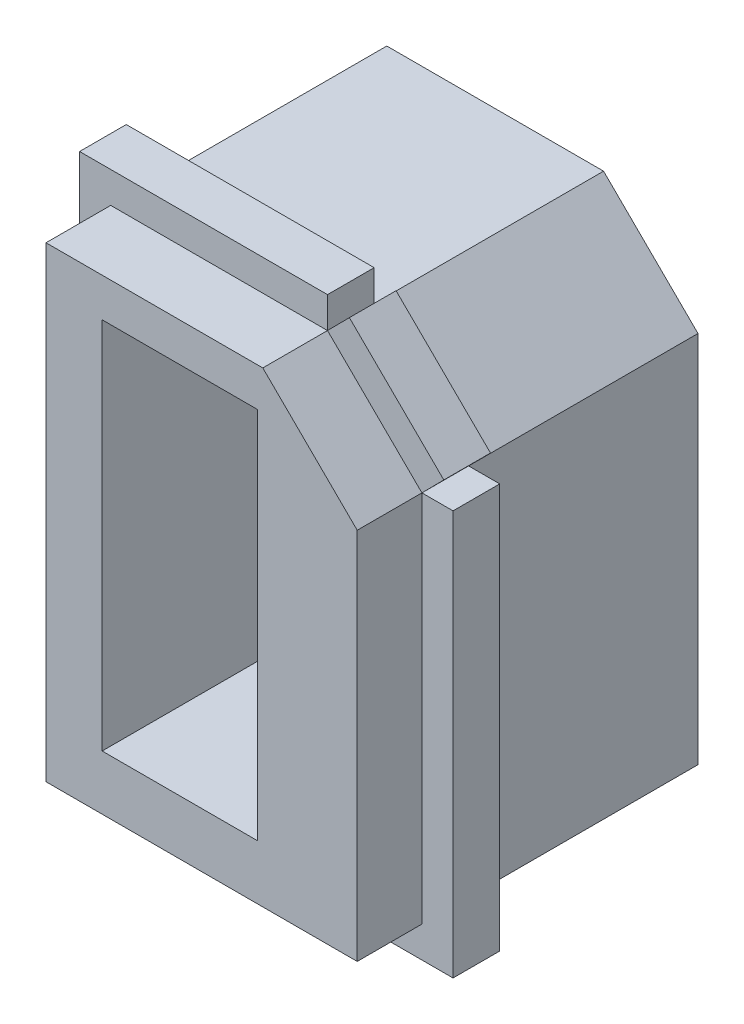
ISO-10303-21;
HEADER;
FILE_DESCRIPTION(('STEP AP214'),'2;1');
FILE_NAME('part.step','',(''),(''),'','','');
FILE_SCHEMA(('AUTOMOTIVE_DESIGN { 1 0 10303 214 1 1 1 1 }'));
ENDSEC;
DATA;
#1=APPLICATION_CONTEXT('core data for automotive mechanical design processes');
#2=APPLICATION_PROTOCOL_DEFINITION('international standard','automotive_design',2000,#1);
#3=PRODUCT_CONTEXT('',#1,'mechanical');
#4=PRODUCT('Part','Part','',(#3));
#5=PRODUCT_RELATED_PRODUCT_CATEGORY('part','',(#4));
#6=PRODUCT_DEFINITION_FORMATION('','',#4);
#7=PRODUCT_DEFINITION_CONTEXT('part definition',#1,'design');
#8=PRODUCT_DEFINITION('design','',#6,#7);
#9=PRODUCT_DEFINITION_SHAPE('','',#8);
#10=(LENGTH_UNIT() NAMED_UNIT(*) SI_UNIT(.MILLI.,.METRE.));
#11=(NAMED_UNIT(*) PLANE_ANGLE_UNIT() SI_UNIT($,.RADIAN.));
#12=(NAMED_UNIT(*) SI_UNIT($,.STERADIAN.) SOLID_ANGLE_UNIT());
#13=UNCERTAINTY_MEASURE_WITH_UNIT(LENGTH_MEASURE(1.E-05),#10,'distance_accuracy_value','');
#14=(GEOMETRIC_REPRESENTATION_CONTEXT(3) GLOBAL_UNCERTAINTY_ASSIGNED_CONTEXT((#13)) GLOBAL_UNIT_ASSIGNED_CONTEXT((#10,
#11,#12)) REPRESENTATION_CONTEXT('',''));
#15=CARTESIAN_POINT('',(0.,0.,0.));
#16=DIRECTION('',(0.,0.,1.));
#17=DIRECTION('',(1.,0.,0.));
#18=AXIS2_PLACEMENT_3D('',#15,#16,#17);
#19=CARTESIAN_POINT('',(-3.03397212543554,15.,10.95));
#20=DIRECTION('',(-0.70311452519662,-0.711076623478463,0.));
#21=DIRECTION('',(0.711076623478463,-0.70311452519662,0.));
#22=AXIS2_PLACEMENT_3D('',#19,#20,#21);
#23=PLANE('',#22);
#24=DIRECTION('',(0.711076623478463,-0.703114525196619,0.));
#25=VECTOR('',#24,1.);
#26=CARTESIAN_POINT('',(-3.03397212543554,15.,8.87087376670331));
#27=LINE('',#26,#25);
#28=CARTESIAN_POINT('',(-3.03397212543554,15.,8.87087376670331));
#29=VERTEX_POINT('',#28);
#30=CARTESIAN_POINT('',(0.,12.,8.87087376670331));
#31=VERTEX_POINT('',#30);
#32=EDGE_CURVE('E392',#29,#31,#27,.T.);
#33=ORIENTED_EDGE('',*,*,#32,.F.);
#34=DIRECTION('',(0.,0.,-1.));
#35=VECTOR('',#34,1.);
#36=CARTESIAN_POINT('',(-3.03397212543554,15.,10.95));
#37=LINE('',#36,#35);
#38=CARTESIAN_POINT('',(-3.03397212543554,15.,10.95));
#39=VERTEX_POINT('',#38);
#40=EDGE_CURVE('E339',#39,#29,#37,.T.);
#41=ORIENTED_EDGE('',*,*,#40,.F.);
#42=DIRECTION('',(-0.711076623478463,0.703114525196619,0.));
#43=VECTOR('',#42,1.);
#44=CARTESIAN_POINT('',(-3.03397212543554,15.,10.95));
#45=LINE('',#44,#43);
#46=CARTESIAN_POINT('',(0.,12.,10.95));
#47=VERTEX_POINT('',#46);
#48=EDGE_CURVE('E305',#47,#39,#45,.T.);
#49=ORIENTED_EDGE('',*,*,#48,.F.);
#50=DIRECTION('',(0.,0.,-1.));
#51=VECTOR('',#50,1.);
#52=CARTESIAN_POINT('',(0.,12.,10.95));
#53=LINE('',#52,#51);
#54=EDGE_CURVE('E37',#47,#31,#53,.T.);
#55=ORIENTED_EDGE('',*,*,#54,.T.);
#56=EDGE_LOOP('',(#33,#41,#49,#55));
#57=FACE_BOUND('',#56,.T.);
#58=ADVANCED_FACE('F33',(#57),#23,.F.);
#59=DIRECTION('',(-0.711076623478463,0.703114525196619,0.));
#60=VECTOR('',#59,1.);
#61=CARTESIAN_POINT('',(-3.03397212543554,15.,7.37087376670331));
#62=LINE('',#61,#60);
#63=CARTESIAN_POINT('',(0.,12.,7.37087376670331));
#64=VERTEX_POINT('',#63);
#65=CARTESIAN_POINT('',(-3.03397212543554,15.,7.37087376670331));
#66=VERTEX_POINT('',#65);
#67=EDGE_CURVE('E198',#64,#66,#62,.T.);
#68=ORIENTED_EDGE('',*,*,#67,.F.);
#69=CARTESIAN_POINT('',(0.,12.,0.));
#70=VERTEX_POINT('',#69);
#71=EDGE_CURVE('E341',#64,#70,#53,.T.);
#72=ORIENTED_EDGE('',*,*,#71,.T.);
#73=DIRECTION('',(-0.711076623478463,0.703114525196619,0.));
#74=VECTOR('',#73,1.);
#75=CARTESIAN_POINT('',(-3.03397212543554,15.,0.));
#76=LINE('',#75,#74);
#77=CARTESIAN_POINT('',(-3.03397212543554,15.,0.));
#78=VERTEX_POINT('',#77);
#79=EDGE_CURVE('E317',#70,#78,#76,.T.);
#80=ORIENTED_EDGE('',*,*,#79,.T.);
#81=EDGE_CURVE('E338',#66,#78,#37,.T.);
#82=ORIENTED_EDGE('',*,*,#81,.F.);
#83=EDGE_LOOP('',(#68,#72,#80,#82));
#84=FACE_BOUND('',#83,.T.);
#85=ADVANCED_FACE('F355',(#84),#23,.F.);
#86=CARTESIAN_POINT('',(0.,0.,10.95));
#87=DIRECTION('',(-1.,0.,0.));
#88=DIRECTION('',(0.,0.,1.));
#89=AXIS2_PLACEMENT_3D('',#86,#87,#88);
#90=PLANE('',#89);
#91=DIRECTION('',(0.,1.,0.));
#92=VECTOR('',#91,1.);
#93=CARTESIAN_POINT('',(0.,-1.,7.37087376670331));
#94=LINE('',#93,#92);
#95=CARTESIAN_POINT('',(0.,0.,7.37087376670331));
#96=VERTEX_POINT('',#95);
#97=EDGE_CURVE('E11',#96,#64,#94,.T.);
#98=ORIENTED_EDGE('',*,*,#97,.F.);
#99=DIRECTION('',(0.,0.,-1.));
#100=VECTOR('',#99,1.);
#101=CARTESIAN_POINT('',(0.,0.,10.95));
#102=LINE('',#101,#100);
#103=CARTESIAN_POINT('',(0.,0.,0.));
#104=VERTEX_POINT('',#103);
#105=EDGE_CURVE('E314',#96,#104,#102,.T.);
#106=ORIENTED_EDGE('',*,*,#105,.T.);
#107=DIRECTION('',(0.,1.,0.));
#108=VECTOR('',#107,1.);
#109=CARTESIAN_POINT('',(0.,0.,0.));
#110=LINE('',#109,#108);
#111=EDGE_CURVE('E301',#104,#70,#110,.T.);
#112=ORIENTED_EDGE('',*,*,#111,.T.);
#113=ORIENTED_EDGE('',*,*,#71,.F.);
#114=EDGE_LOOP('',(#98,#106,#112,#113));
#115=FACE_BOUND('',#114,.T.);
#116=ADVANCED_FACE('F35',(#115),#90,.F.);
#117=DIRECTION('',(0.,-1.,0.));
#118=VECTOR('',#117,1.);
#119=CARTESIAN_POINT('',(0.,12.,8.87087376670331));
#120=LINE('',#119,#118);
#121=CARTESIAN_POINT('',(0.,0.,8.87087376670331));
#122=VERTEX_POINT('',#121);
#123=EDGE_CURVE('E50',#31,#122,#120,.T.);
#124=ORIENTED_EDGE('',*,*,#123,.F.);
#125=ORIENTED_EDGE('',*,*,#54,.F.);
#126=DIRECTION('',(0.,1.,0.));
#127=VECTOR('',#126,1.);
#128=CARTESIAN_POINT('',(0.,0.,10.95));
#129=LINE('',#128,#127);
#130=CARTESIAN_POINT('',(0.,0.,10.95));
#131=VERTEX_POINT('',#130);
#132=EDGE_CURVE('E302',#131,#47,#129,.T.);
#133=ORIENTED_EDGE('',*,*,#132,.F.);
#134=EDGE_CURVE('E328',#131,#122,#102,.T.);
#135=ORIENTED_EDGE('',*,*,#134,.T.);
#136=EDGE_LOOP('',(#124,#125,#133,#135));
#137=FACE_BOUND('',#136,.T.);
#138=ADVANCED_FACE('F432',(#137),#90,.F.);
#139=CARTESIAN_POINT('',(-10.,0.,10.95));
#140=DIRECTION('',(1.,0.,0.));
#141=DIRECTION('',(0.,0.,-1.));
#142=AXIS2_PLACEMENT_3D('',#139,#140,#141);
#143=PLANE('',#142);
#144=DIRECTION('',(0.,-1.,0.));
#145=VECTOR('',#144,1.);
#146=CARTESIAN_POINT('',(-10.,16.,7.37087376670331));
#147=LINE('',#146,#145);
#148=CARTESIAN_POINT('',(-10.,15.,7.37087376670331));
#149=VERTEX_POINT('',#148);
#150=CARTESIAN_POINT('',(-10.,0.,7.37087376670331));
#151=VERTEX_POINT('',#150);
#152=EDGE_CURVE('E42',#149,#151,#147,.T.);
#153=ORIENTED_EDGE('',*,*,#152,.F.);
#154=DIRECTION('',(0.,0.,-1.));
#155=VECTOR('',#154,1.);
#156=CARTESIAN_POINT('',(-10.,15.,10.95));
#157=LINE('',#156,#155);
#158=CARTESIAN_POINT('',(-10.,15.,0.));
#159=VERTEX_POINT('',#158);
#160=EDGE_CURVE('E335',#149,#159,#157,.T.);
#161=ORIENTED_EDGE('',*,*,#160,.T.);
#162=DIRECTION('',(0.,-1.,0.));
#163=VECTOR('',#162,1.);
#164=CARTESIAN_POINT('',(-10.,0.,0.));
#165=LINE('',#164,#163);
#166=CARTESIAN_POINT('',(-10.,0.,0.));
#167=VERTEX_POINT('',#166);
#168=EDGE_CURVE('E323',#159,#167,#165,.T.);
#169=ORIENTED_EDGE('',*,*,#168,.T.);
#170=DIRECTION('',(0.,0.,-1.));
#171=VECTOR('',#170,1.);
#172=CARTESIAN_POINT('',(-10.,0.,10.95));
#173=LINE('',#172,#171);
#174=EDGE_CURVE('E331',#151,#167,#173,.T.);
#175=ORIENTED_EDGE('',*,*,#174,.F.);
#176=EDGE_LOOP('',(#153,#161,#169,#175));
#177=FACE_BOUND('',#176,.T.);
#178=ADVANCED_FACE('F364',(#177),#143,.F.);
#179=DIRECTION('',(0.,1.,0.));
#180=VECTOR('',#179,1.);
#181=CARTESIAN_POINT('',(-10.,-1.,8.87087376670331));
#182=LINE('',#181,#180);
#183=CARTESIAN_POINT('',(-10.,0.,8.87087376670331));
#184=VERTEX_POINT('',#183);
#185=CARTESIAN_POINT('',(-10.,15.,8.87087376670331));
#186=VERTEX_POINT('',#185);
#187=EDGE_CURVE('E56',#184,#186,#182,.T.);
#188=ORIENTED_EDGE('',*,*,#187,.F.);
#189=CARTESIAN_POINT('',(-10.,0.,10.95));
#190=VERTEX_POINT('',#189);
#191=EDGE_CURVE('E332',#190,#184,#173,.T.);
#192=ORIENTED_EDGE('',*,*,#191,.F.);
#193=DIRECTION('',(0.,-1.,0.));
#194=VECTOR('',#193,1.);
#195=CARTESIAN_POINT('',(-10.,0.,10.95));
#196=LINE('',#195,#194);
#197=CARTESIAN_POINT('',(-10.,15.,10.95));
#198=VERTEX_POINT('',#197);
#199=EDGE_CURVE('E310',#198,#190,#196,.T.);
#200=ORIENTED_EDGE('',*,*,#199,.F.);
#201=EDGE_CURVE('E336',#198,#186,#157,.T.);
#202=ORIENTED_EDGE('',*,*,#201,.T.);
#203=EDGE_LOOP('',(#188,#192,#200,#202));
#204=FACE_BOUND('',#203,.T.);
#205=ADVANCED_FACE('F381',(#204),#143,.F.);
#206=CARTESIAN_POINT('',(0.,0.,10.95));
#207=DIRECTION('',(0.,1.,0.));
#208=DIRECTION('',(-1.,0.,0.));
#209=AXIS2_PLACEMENT_3D('',#206,#207,#208);
#210=PLANE('',#209);
#211=DIRECTION('',(1.,0.,0.));
#212=VECTOR('',#211,1.);
#213=CARTESIAN_POINT('',(-10.,0.,7.37087376670331));
#214=LINE('',#213,#212);
#215=EDGE_CURVE('E247',#151,#96,#214,.T.);
#216=ORIENTED_EDGE('',*,*,#215,.F.);
#217=ORIENTED_EDGE('',*,*,#174,.T.);
#218=DIRECTION('',(1.,0.,0.));
#219=VECTOR('',#218,1.);
#220=CARTESIAN_POINT('',(0.,0.,0.));
#221=LINE('',#220,#219);
#222=EDGE_CURVE('E306',#167,#104,#221,.T.);
#223=ORIENTED_EDGE('',*,*,#222,.T.);
#224=ORIENTED_EDGE('',*,*,#105,.F.);
#225=EDGE_LOOP('',(#216,#217,#223,#224));
#226=FACE_BOUND('',#225,.T.);
#227=ADVANCED_FACE('F413',(#226),#210,.F.);
#228=CARTESIAN_POINT('',(-10.,15.,10.95));
#229=DIRECTION('',(0.,-1.,0.));
#230=DIRECTION('',(0.,0.,-1.));
#231=AXIS2_PLACEMENT_3D('',#228,#229,#230);
#232=PLANE('',#231);
#233=DIRECTION('',(-1.,0.,0.));
#234=VECTOR('',#233,1.);
#235=CARTESIAN_POINT('',(-10.,15.,7.37087376670331));
#236=LINE('',#235,#234);
#237=EDGE_CURVE('E256',#66,#149,#236,.T.);
#238=ORIENTED_EDGE('',*,*,#237,.F.);
#239=ORIENTED_EDGE('',*,*,#81,.T.);
#240=DIRECTION('',(-1.,0.,0.));
#241=VECTOR('',#240,1.);
#242=CARTESIAN_POINT('',(-10.,15.,0.));
#243=LINE('',#242,#241);
#244=EDGE_CURVE('E320',#78,#159,#243,.T.);
#245=ORIENTED_EDGE('',*,*,#244,.T.);
#246=ORIENTED_EDGE('',*,*,#160,.F.);
#247=EDGE_LOOP('',(#238,#239,#245,#246));
#248=FACE_BOUND('',#247,.T.);
#249=ADVANCED_FACE('F348',(#248),#232,.F.);
#250=DIRECTION('',(1.,0.,0.));
#251=VECTOR('',#250,1.);
#252=CARTESIAN_POINT('',(-10.,15.,8.87087376670331));
#253=LINE('',#252,#251);
#254=EDGE_CURVE('E249',#186,#29,#253,.T.);
#255=ORIENTED_EDGE('',*,*,#254,.F.);
#256=ORIENTED_EDGE('',*,*,#201,.F.);
#257=DIRECTION('',(-1.,0.,0.));
#258=VECTOR('',#257,1.);
#259=CARTESIAN_POINT('',(-10.,15.,10.95));
#260=LINE('',#259,#258);
#261=EDGE_CURVE('E308',#39,#198,#260,.T.);
#262=ORIENTED_EDGE('',*,*,#261,.F.);
#263=ORIENTED_EDGE('',*,*,#40,.T.);
#264=EDGE_LOOP('',(#255,#256,#262,#263));
#265=FACE_BOUND('',#264,.T.);
#266=ADVANCED_FACE('F378',(#265),#232,.F.);
#267=CARTESIAN_POINT('',(0.,0.,10.95));
#268=DIRECTION('',(0.,0.,-1.));
#269=DIRECTION('',(-1.,0.,0.));
#270=AXIS2_PLACEMENT_3D('',#267,#268,#269);
#271=PLANE('',#270);
#272=ORIENTED_EDGE('',*,*,#132,.T.);
#273=ORIENTED_EDGE('',*,*,#48,.T.);
#274=ORIENTED_EDGE('',*,*,#261,.T.);
#275=ORIENTED_EDGE('',*,*,#199,.T.);
#276=DIRECTION('',(1.,0.,0.));
#277=VECTOR('',#276,1.);
#278=CARTESIAN_POINT('',(0.,0.,10.95));
#279=LINE('',#278,#277);
#280=EDGE_CURVE('E312',#190,#131,#279,.T.);
#281=ORIENTED_EDGE('',*,*,#280,.T.);
#282=EDGE_LOOP('',(#272,#273,#274,#275,#281));
#283=FACE_BOUND('',#282,.T.);
#284=DIRECTION('',(-1.,0.,0.));
#285=VECTOR('',#284,1.);
#286=CARTESIAN_POINT('',(-8.19642857142857,13.7580574912892,10.95));
#287=LINE('',#286,#285);
#288=CARTESIAN_POINT('',(-3.19642857142857,13.7580574912892,10.95));
#289=VERTEX_POINT('',#288);
#290=CARTESIAN_POINT('',(-8.19642857142857,13.7580574912892,10.95));
#291=VERTEX_POINT('',#290);
#292=EDGE_CURVE('E271',#289,#291,#287,.T.);
#293=ORIENTED_EDGE('',*,*,#292,.F.);
#294=DIRECTION('',(0.,1.,0.));
#295=VECTOR('',#294,1.);
#296=CARTESIAN_POINT('',(-3.19642857142857,13.7580574912892,10.95));
#297=LINE('',#296,#295);
#298=CARTESIAN_POINT('',(-3.19642857142857,1.7580574912892,10.95));
#299=VERTEX_POINT('',#298);
#300=EDGE_CURVE('E279',#299,#289,#297,.T.);
#301=ORIENTED_EDGE('',*,*,#300,.F.);
#302=DIRECTION('',(1.,0.,0.));
#303=VECTOR('',#302,1.);
#304=CARTESIAN_POINT('',(-3.19642857142857,1.7580574912892,10.95));
#305=LINE('',#304,#303);
#306=CARTESIAN_POINT('',(-8.19642857142857,1.7580574912892,10.95));
#307=VERTEX_POINT('',#306);
#308=EDGE_CURVE('E276',#307,#299,#305,.T.);
#309=ORIENTED_EDGE('',*,*,#308,.F.);
#310=DIRECTION('',(0.,-1.,0.));
#311=VECTOR('',#310,1.);
#312=CARTESIAN_POINT('',(-8.19642857142857,1.7580574912892,10.95));
#313=LINE('',#312,#311);
#314=EDGE_CURVE('E273',#291,#307,#313,.T.);
#315=ORIENTED_EDGE('',*,*,#314,.F.);
#316=EDGE_LOOP('',(#293,#301,#309,#315));
#317=FACE_BOUND('',#316,.T.);
#318=ADVANCED_FACE('F385',(#283,#317),#271,.F.);
#319=CARTESIAN_POINT('',(0.,0.,0.));
#320=DIRECTION('',(0.,0.,-1.));
#321=DIRECTION('',(-1.,0.,0.));
#322=AXIS2_PLACEMENT_3D('',#319,#320,#321);
#323=PLANE('',#322);
#324=ORIENTED_EDGE('',*,*,#111,.F.);
#325=ORIENTED_EDGE('',*,*,#222,.F.);
#326=ORIENTED_EDGE('',*,*,#168,.F.);
#327=ORIENTED_EDGE('',*,*,#244,.F.);
#328=ORIENTED_EDGE('',*,*,#79,.F.);
#329=EDGE_LOOP('',(#324,#325,#326,#327,#328));
#330=FACE_BOUND('',#329,.T.);
#331=DIRECTION('',(0.,1.,0.));
#332=VECTOR('',#331,1.);
#333=CARTESIAN_POINT('',(-3.19642857142857,13.7580574912892,0.));
#334=LINE('',#333,#332);
#335=CARTESIAN_POINT('',(-3.19642857142857,1.7580574912892,0.));
#336=VERTEX_POINT('',#335);
#337=CARTESIAN_POINT('',(-3.19642857142857,13.7580574912892,0.));
#338=VERTEX_POINT('',#337);
#339=EDGE_CURVE('E274',#336,#338,#334,.T.);
#340=ORIENTED_EDGE('',*,*,#339,.T.);
#341=DIRECTION('',(-1.,0.,0.));
#342=VECTOR('',#341,1.);
#343=CARTESIAN_POINT('',(-8.19642857142857,13.7580574912892,0.));
#344=LINE('',#343,#342);
#345=CARTESIAN_POINT('',(-8.19642857142857,13.7580574912892,0.));
#346=VERTEX_POINT('',#345);
#347=EDGE_CURVE('E270',#338,#346,#344,.T.);
#348=ORIENTED_EDGE('',*,*,#347,.T.);
#349=DIRECTION('',(0.,-1.,0.));
#350=VECTOR('',#349,1.);
#351=CARTESIAN_POINT('',(-8.19642857142857,1.7580574912892,0.));
#352=LINE('',#351,#350);
#353=CARTESIAN_POINT('',(-8.19642857142857,1.7580574912892,0.));
#354=VERTEX_POINT('',#353);
#355=EDGE_CURVE('E284',#346,#354,#352,.T.);
#356=ORIENTED_EDGE('',*,*,#355,.T.);
#357=DIRECTION('',(1.,0.,0.));
#358=VECTOR('',#357,1.);
#359=CARTESIAN_POINT('',(-3.19642857142857,1.7580574912892,0.));
#360=LINE('',#359,#358);
#361=EDGE_CURVE('E287',#354,#336,#360,.T.);
#362=ORIENTED_EDGE('',*,*,#361,.T.);
#363=EDGE_LOOP('',(#340,#348,#356,#362));
#364=FACE_BOUND('',#363,.T.);
#365=ADVANCED_FACE('F359',(#330,#364),#323,.T.);
#366=ORIENTED_EDGE('',*,*,#191,.T.);
#367=DIRECTION('',(1.,0.,0.));
#368=VECTOR('',#367,1.);
#369=CARTESIAN_POINT('',(-10.,0.,8.87087376670331));
#370=LINE('',#369,#368);
#371=EDGE_CURVE('E241',#184,#122,#370,.T.);
#372=ORIENTED_EDGE('',*,*,#371,.T.);
#373=ORIENTED_EDGE('',*,*,#134,.F.);
#374=ORIENTED_EDGE('',*,*,#280,.F.);
#375=EDGE_LOOP('',(#366,#372,#373,#374));
#376=FACE_BOUND('',#375,.T.);
#377=ADVANCED_FACE('F416',(#376),#210,.F.);
#378=CARTESIAN_POINT('',(-8.19642857142857,13.7580574912892,10.95));
#379=DIRECTION('',(0.,-1.,0.));
#380=DIRECTION('',(0.,0.,-1.));
#381=AXIS2_PLACEMENT_3D('',#378,#379,#380);
#382=PLANE('',#381);
#383=ORIENTED_EDGE('',*,*,#347,.F.);
#384=DIRECTION('',(0.,0.,-1.));
#385=VECTOR('',#384,1.);
#386=CARTESIAN_POINT('',(-3.19642857142857,13.7580574912892,10.95));
#387=LINE('',#386,#385);
#388=EDGE_CURVE('E281',#289,#338,#387,.T.);
#389=ORIENTED_EDGE('',*,*,#388,.F.);
#390=ORIENTED_EDGE('',*,*,#292,.T.);
#391=DIRECTION('',(0.,0.,-1.));
#392=VECTOR('',#391,1.);
#393=CARTESIAN_POINT('',(-8.19642857142857,13.7580574912892,10.95));
#394=LINE('',#393,#392);
#395=EDGE_CURVE('E298',#291,#346,#394,.T.);
#396=ORIENTED_EDGE('',*,*,#395,.T.);
#397=EDGE_LOOP('',(#383,#389,#390,#396));
#398=FACE_BOUND('',#397,.T.);
#399=ADVANCED_FACE('F425',(#398),#382,.T.);
#400=CARTESIAN_POINT('',(-8.19642857142857,1.7580574912892,10.95));
#401=DIRECTION('',(1.,0.,0.));
#402=DIRECTION('',(0.,0.,-1.));
#403=AXIS2_PLACEMENT_3D('',#400,#401,#402);
#404=PLANE('',#403);
#405=ORIENTED_EDGE('',*,*,#355,.F.);
#406=ORIENTED_EDGE('',*,*,#395,.F.);
#407=ORIENTED_EDGE('',*,*,#314,.T.);
#408=DIRECTION('',(0.,0.,-1.));
#409=VECTOR('',#408,1.);
#410=CARTESIAN_POINT('',(-8.19642857142857,1.7580574912892,10.95));
#411=LINE('',#410,#409);
#412=EDGE_CURVE('E296',#307,#354,#411,.T.);
#413=ORIENTED_EDGE('',*,*,#412,.T.);
#414=EDGE_LOOP('',(#405,#406,#407,#413));
#415=FACE_BOUND('',#414,.T.);
#416=ADVANCED_FACE('F551',(#415),#404,.T.);
#417=CARTESIAN_POINT('',(-3.19642857142857,1.7580574912892,10.95));
#418=DIRECTION('',(0.,1.,0.));
#419=DIRECTION('',(-1.,0.,0.));
#420=AXIS2_PLACEMENT_3D('',#417,#418,#419);
#421=PLANE('',#420);
#422=ORIENTED_EDGE('',*,*,#361,.F.);
#423=ORIENTED_EDGE('',*,*,#412,.F.);
#424=ORIENTED_EDGE('',*,*,#308,.T.);
#425=DIRECTION('',(0.,0.,-1.));
#426=VECTOR('',#425,1.);
#427=CARTESIAN_POINT('',(-3.19642857142857,1.7580574912892,10.95));
#428=LINE('',#427,#426);
#429=EDGE_CURVE('E294',#299,#336,#428,.T.);
#430=ORIENTED_EDGE('',*,*,#429,.T.);
#431=EDGE_LOOP('',(#422,#423,#424,#430));
#432=FACE_BOUND('',#431,.T.);
#433=ADVANCED_FACE('F539',(#432),#421,.T.);
#434=CARTESIAN_POINT('',(-3.19642857142857,13.7580574912892,10.95));
#435=DIRECTION('',(-1.,0.,0.));
#436=DIRECTION('',(0.,0.,1.));
#437=AXIS2_PLACEMENT_3D('',#434,#435,#436);
#438=PLANE('',#437);
#439=ORIENTED_EDGE('',*,*,#339,.F.);
#440=ORIENTED_EDGE('',*,*,#429,.F.);
#441=ORIENTED_EDGE('',*,*,#300,.T.);
#442=ORIENTED_EDGE('',*,*,#388,.T.);
#443=EDGE_LOOP('',(#439,#440,#441,#442));
#444=FACE_BOUND('',#443,.T.);
#445=ADVANCED_FACE('F534',(#444),#438,.T.);
#446=CARTESIAN_POINT('',(-10.,16.,8.87087376670331));
#447=DIRECTION('',(0.,0.,-1.));
#448=DIRECTION('',(-1.,0.,0.));
#449=AXIS2_PLACEMENT_3D('',#446,#447,#448);
#450=PLANE('',#449);
#451=ORIENTED_EDGE('',*,*,#254,.T.);
#452=DIRECTION('',(0.,-1.,0.));
#453=VECTOR('',#452,1.);
#454=CARTESIAN_POINT('',(-3.03397212543554,16.,8.87087376670331));
#455=LINE('',#454,#453);
#456=CARTESIAN_POINT('',(-3.03397212543554,16.,8.87087376670331));
#457=VERTEX_POINT('',#456);
#458=EDGE_CURVE('E267',#457,#29,#455,.T.);
#459=ORIENTED_EDGE('',*,*,#458,.F.);
#460=DIRECTION('',(1.,0.,0.));
#461=VECTOR('',#460,1.);
#462=CARTESIAN_POINT('',(-10.,16.,8.87087376670331));
#463=LINE('',#462,#461);
#464=CARTESIAN_POINT('',(-11.,16.,8.87087376670331));
#465=VERTEX_POINT('',#464);
#466=EDGE_CURVE('E253',#465,#457,#463,.T.);
#467=ORIENTED_EDGE('',*,*,#466,.F.);
#468=DIRECTION('',(0.,1.,0.));
#469=VECTOR('',#468,1.);
#470=CARTESIAN_POINT('',(-11.,-1.,8.87087376670331));
#471=LINE('',#470,#469);
#472=CARTESIAN_POINT('',(-11.,-1.,8.87087376670331));
#473=VERTEX_POINT('',#472);
#474=EDGE_CURVE('E232',#473,#465,#471,.T.);
#475=ORIENTED_EDGE('',*,*,#474,.F.);
#476=DIRECTION('',(1.,0.,0.));
#477=VECTOR('',#476,1.);
#478=CARTESIAN_POINT('',(-10.,-1.,8.87087376670331));
#479=LINE('',#478,#477);
#480=CARTESIAN_POINT('',(1.,-1.,8.87087376670331));
#481=VERTEX_POINT('',#480);
#482=EDGE_CURVE('E244',#473,#481,#479,.T.);
#483=ORIENTED_EDGE('',*,*,#482,.T.);
#484=DIRECTION('',(0.,-1.,0.));
#485=VECTOR('',#484,1.);
#486=CARTESIAN_POINT('',(1.,12.,8.87087376670331));
#487=LINE('',#486,#485);
#488=CARTESIAN_POINT('',(1.,12.,8.87087376670331));
#489=VERTEX_POINT('',#488);
#490=EDGE_CURVE('E215',#489,#481,#487,.T.);
#491=ORIENTED_EDGE('',*,*,#490,.F.);
#492=DIRECTION('',(-1.,0.,0.));
#493=VECTOR('',#492,1.);
#494=CARTESIAN_POINT('',(1.,12.,8.87087376670331));
#495=LINE('',#494,#493);
#496=EDGE_CURVE('E227',#489,#31,#495,.T.);
#497=ORIENTED_EDGE('',*,*,#496,.T.);
#498=ORIENTED_EDGE('',*,*,#123,.T.);
#499=ORIENTED_EDGE('',*,*,#371,.F.);
#500=ORIENTED_EDGE('',*,*,#187,.T.);
#501=EDGE_LOOP('',(#451,#459,#467,#475,#483,#491,#497,#498,#499,#500));
#502=FACE_BOUND('',#501,.T.);
#503=ADVANCED_FACE('F375',(#502),#450,.F.);
#504=CARTESIAN_POINT('',(-3.03397212543554,16.,7.37087376670331));
#505=DIRECTION('',(-1.,0.,0.));
#506=DIRECTION('',(0.,0.,1.));
#507=AXIS2_PLACEMENT_3D('',#504,#505,#506);
#508=PLANE('',#507);
#509=DIRECTION('',(0.,0.,-1.));
#510=VECTOR('',#509,1.);
#511=CARTESIAN_POINT('',(-3.03397212543554,15.,7.37087376670331));
#512=LINE('',#511,#510);
#513=EDGE_CURVE('E202',#29,#66,#512,.T.);
#514=ORIENTED_EDGE('',*,*,#513,.T.);
#515=DIRECTION('',(0.,-1.,0.));
#516=VECTOR('',#515,1.);
#517=CARTESIAN_POINT('',(-3.03397212543554,16.,7.37087376670331));
#518=LINE('',#517,#516);
#519=CARTESIAN_POINT('',(-3.03397212543554,16.,7.37087376670331));
#520=VERTEX_POINT('',#519);
#521=EDGE_CURVE('E260',#520,#66,#518,.T.);
#522=ORIENTED_EDGE('',*,*,#521,.F.);
#523=DIRECTION('',(0.,0.,-1.));
#524=VECTOR('',#523,1.);
#525=CARTESIAN_POINT('',(-3.03397212543554,16.,7.37087376670331));
#526=LINE('',#525,#524);
#527=EDGE_CURVE('E255',#457,#520,#526,.T.);
#528=ORIENTED_EDGE('',*,*,#527,.F.);
#529=ORIENTED_EDGE('',*,*,#458,.T.);
#530=EDGE_LOOP('',(#514,#522,#528,#529));
#531=FACE_BOUND('',#530,.T.);
#532=ADVANCED_FACE('F373',(#531),#508,.F.);
#533=CARTESIAN_POINT('',(-10.,16.,7.37087376670331));
#534=DIRECTION('',(0.,0.,1.));
#535=DIRECTION('',(1.,0.,0.));
#536=AXIS2_PLACEMENT_3D('',#533,#534,#535);
#537=PLANE('',#536);
#538=ORIENTED_EDGE('',*,*,#237,.T.);
#539=ORIENTED_EDGE('',*,*,#152,.T.);
#540=ORIENTED_EDGE('',*,*,#215,.T.);
#541=ORIENTED_EDGE('',*,*,#97,.T.);
#542=DIRECTION('',(-1.,0.,0.));
#543=VECTOR('',#542,1.);
#544=CARTESIAN_POINT('',(1.,12.,7.37087376670331));
#545=LINE('',#544,#543);
#546=CARTESIAN_POINT('',(1.,12.,7.37087376670331));
#547=VERTEX_POINT('',#546);
#548=EDGE_CURVE('E222',#547,#64,#545,.T.);
#549=ORIENTED_EDGE('',*,*,#548,.F.);
#550=DIRECTION('',(0.,1.,0.));
#551=VECTOR('',#550,1.);
#552=CARTESIAN_POINT('',(1.,-1.,7.37087376670331));
#553=LINE('',#552,#551);
#554=CARTESIAN_POINT('',(1.,-1.,7.37087376670331));
#555=VERTEX_POINT('',#554);
#556=EDGE_CURVE('E221',#555,#547,#553,.T.);
#557=ORIENTED_EDGE('',*,*,#556,.F.);
#558=DIRECTION('',(1.,0.,0.));
#559=VECTOR('',#558,1.);
#560=CARTESIAN_POINT('',(-10.,-1.,7.37087376670331));
#561=LINE('',#560,#559);
#562=CARTESIAN_POINT('',(-11.,-1.,7.37087376670331));
#563=VERTEX_POINT('',#562);
#564=EDGE_CURVE('E246',#563,#555,#561,.T.);
#565=ORIENTED_EDGE('',*,*,#564,.F.);
#566=DIRECTION('',(0.,-1.,0.));
#567=VECTOR('',#566,1.);
#568=CARTESIAN_POINT('',(-11.,16.,7.37087376670331));
#569=LINE('',#568,#567);
#570=CARTESIAN_POINT('',(-11.,16.,7.37087376670331));
#571=VERTEX_POINT('',#570);
#572=EDGE_CURVE('E238',#571,#563,#569,.T.);
#573=ORIENTED_EDGE('',*,*,#572,.F.);
#574=DIRECTION('',(-1.,0.,0.));
#575=VECTOR('',#574,1.);
#576=CARTESIAN_POINT('',(-10.,16.,7.37087376670331));
#577=LINE('',#576,#575);
#578=EDGE_CURVE('E258',#520,#571,#577,.T.);
#579=ORIENTED_EDGE('',*,*,#578,.F.);
#580=ORIENTED_EDGE('',*,*,#521,.T.);
#581=EDGE_LOOP('',(#538,#539,#540,#541,#549,#557,#565,#573,#579,#580));
#582=FACE_BOUND('',#581,.T.);
#583=ADVANCED_FACE('F366',(#582),#537,.F.);
#584=CARTESIAN_POINT('',(0.,16.,0.));
#585=DIRECTION('',(0.,-1.,0.));
#586=DIRECTION('',(0.,0.,-1.));
#587=AXIS2_PLACEMENT_3D('',#584,#585,#586);
#588=PLANE('',#587);
#589=ORIENTED_EDGE('',*,*,#578,.T.);
#590=DIRECTION('',(0.,0.,-1.));
#591=VECTOR('',#590,1.);
#592=CARTESIAN_POINT('',(-11.,16.,8.87087376670331));
#593=LINE('',#592,#591);
#594=EDGE_CURVE('E235',#465,#571,#593,.T.);
#595=ORIENTED_EDGE('',*,*,#594,.F.);
#596=ORIENTED_EDGE('',*,*,#466,.T.);
#597=ORIENTED_EDGE('',*,*,#527,.T.);
#598=EDGE_LOOP('',(#589,#595,#596,#597));
#599=FACE_BOUND('',#598,.T.);
#600=ADVANCED_FACE('F475',(#599),#588,.F.);
#601=CARTESIAN_POINT('',(0.,-1.,0.));
#602=DIRECTION('',(0.,1.,0.));
#603=DIRECTION('',(-1.,0.,0.));
#604=AXIS2_PLACEMENT_3D('',#601,#602,#603);
#605=PLANE('',#604);
#606=ORIENTED_EDGE('',*,*,#482,.F.);
#607=DIRECTION('',(0.,0.,1.));
#608=VECTOR('',#607,1.);
#609=CARTESIAN_POINT('',(-11.,-1.,7.37087376670331));
#610=LINE('',#609,#608);
#611=EDGE_CURVE('E229',#563,#473,#610,.T.);
#612=ORIENTED_EDGE('',*,*,#611,.F.);
#613=ORIENTED_EDGE('',*,*,#564,.T.);
#614=DIRECTION('',(0.,0.,-1.));
#615=VECTOR('',#614,1.);
#616=CARTESIAN_POINT('',(1.,-1.,8.87087376670331));
#617=LINE('',#616,#615);
#618=EDGE_CURVE('E218',#481,#555,#617,.T.);
#619=ORIENTED_EDGE('',*,*,#618,.F.);
#620=EDGE_LOOP('',(#606,#612,#613,#619));
#621=FACE_BOUND('',#620,.T.);
#622=ADVANCED_FACE('F469',(#621),#605,.F.);
#623=CARTESIAN_POINT('',(-11.,0.,0.));
#624=DIRECTION('',(-1.,0.,0.));
#625=DIRECTION('',(0.,0.,1.));
#626=AXIS2_PLACEMENT_3D('',#623,#624,#625);
#627=PLANE('',#626);
#628=ORIENTED_EDGE('',*,*,#611,.T.);
#629=ORIENTED_EDGE('',*,*,#474,.T.);
#630=ORIENTED_EDGE('',*,*,#594,.T.);
#631=ORIENTED_EDGE('',*,*,#572,.T.);
#632=EDGE_LOOP('',(#628,#629,#630,#631));
#633=FACE_BOUND('',#632,.T.);
#634=ADVANCED_FACE('F474',(#633),#627,.T.);
#635=CARTESIAN_POINT('',(1.,12.,7.37087376670331));
#636=DIRECTION('',(0.,-1.,0.));
#637=DIRECTION('',(0.,0.,-1.));
#638=AXIS2_PLACEMENT_3D('',#635,#636,#637);
#639=PLANE('',#638);
#640=DIRECTION('',(0.,0.,1.));
#641=VECTOR('',#640,1.);
#642=CARTESIAN_POINT('',(0.,12.,7.37087376670331));
#643=LINE('',#642,#641);
#644=EDGE_CURVE('E204',#64,#31,#643,.T.);
#645=ORIENTED_EDGE('',*,*,#644,.T.);
#646=ORIENTED_EDGE('',*,*,#496,.F.);
#647=DIRECTION('',(0.,0.,1.));
#648=VECTOR('',#647,1.);
#649=CARTESIAN_POINT('',(1.,12.,7.37087376670331));
#650=LINE('',#649,#648);
#651=EDGE_CURVE('E212',#547,#489,#650,.T.);
#652=ORIENTED_EDGE('',*,*,#651,.F.);
#653=ORIENTED_EDGE('',*,*,#548,.T.);
#654=EDGE_LOOP('',(#645,#646,#652,#653));
#655=FACE_BOUND('',#654,.T.);
#656=ADVANCED_FACE('F410',(#655),#639,.F.);
#657=CARTESIAN_POINT('',(1.,0.,0.));
#658=DIRECTION('',(1.,0.,0.));
#659=DIRECTION('',(0.,0.,-1.));
#660=AXIS2_PLACEMENT_3D('',#657,#658,#659);
#661=PLANE('',#660);
#662=ORIENTED_EDGE('',*,*,#651,.T.);
#663=ORIENTED_EDGE('',*,*,#490,.T.);
#664=ORIENTED_EDGE('',*,*,#618,.T.);
#665=ORIENTED_EDGE('',*,*,#556,.T.);
#666=EDGE_LOOP('',(#662,#663,#664,#665));
#667=FACE_BOUND('',#666,.T.);
#668=ADVANCED_FACE('F457',(#667),#661,.T.);
#669=CARTESIAN_POINT('',(-2.33085760023892,15.7110766234785,8.87087376670331));
#670=DIRECTION('',(0.711076623478463,-0.70311452519662,0.));
#671=DIRECTION('',(0.70311452519662,0.711076623478463,0.));
#672=AXIS2_PLACEMENT_3D('',#669,#670,#671);
#673=PLANE('',#672);
#674=ORIENTED_EDGE('',*,*,#513,.F.);
#675=DIRECTION('',(-0.70311452519662,-0.711076623478463,0.));
#676=VECTOR('',#675,1.);
#677=CARTESIAN_POINT('',(-2.33085760023892,15.7110766234785,8.87087376670331));
#678=LINE('',#677,#676);
#679=CARTESIAN_POINT('',(-2.33085760023892,15.7110766234785,8.87087376670331));
#680=VERTEX_POINT('',#679);
#681=EDGE_CURVE('E183',#680,#29,#678,.T.);
#682=ORIENTED_EDGE('',*,*,#681,.F.);
#683=DIRECTION('',(0.,0.,1.));
#684=VECTOR('',#683,1.);
#685=CARTESIAN_POINT('',(-2.33085760023892,15.7110766234785,8.87087376670331));
#686=LINE('',#685,#684);
#687=CARTESIAN_POINT('',(-2.33085760023892,15.7110766234785,7.37087376670331));
#688=VERTEX_POINT('',#687);
#689=EDGE_CURVE('E189',#688,#680,#686,.T.);
#690=ORIENTED_EDGE('',*,*,#689,.F.);
#691=DIRECTION('',(-0.70311452519662,-0.711076623478463,0.));
#692=VECTOR('',#691,1.);
#693=CARTESIAN_POINT('',(-2.33085760023892,15.7110766234785,7.37087376670331));
#694=LINE('',#693,#692);
#695=EDGE_CURVE('E398',#688,#66,#694,.T.);
#696=ORIENTED_EDGE('',*,*,#695,.T.);
#697=EDGE_LOOP('',(#674,#682,#690,#696));
#698=FACE_BOUND('',#697,.T.);
#699=ADVANCED_FACE('F200',(#698),#673,.F.);
#700=CARTESIAN_POINT('',(-2.33085760023892,15.7110766234785,8.87087376670331));
#701=DIRECTION('',(0.,0.,-1.));
#702=DIRECTION('',(-1.,0.,0.));
#703=AXIS2_PLACEMENT_3D('',#700,#701,#702);
#704=PLANE('',#703);
#705=ORIENTED_EDGE('',*,*,#32,.T.);
#706=DIRECTION('',(-0.70311452519662,-0.711076623478463,0.));
#707=VECTOR('',#706,1.);
#708=CARTESIAN_POINT('',(0.703114525196619,12.7110766234785,8.87087376670331));
#709=LINE('',#708,#707);
#710=CARTESIAN_POINT('',(0.703114525196619,12.7110766234785,8.87087376670331));
#711=VERTEX_POINT('',#710);
#712=EDGE_CURVE('E185',#711,#31,#709,.T.);
#713=ORIENTED_EDGE('',*,*,#712,.F.);
#714=DIRECTION('',(0.711076623478463,-0.703114525196619,0.));
#715=VECTOR('',#714,1.);
#716=CARTESIAN_POINT('',(-2.33085760023892,15.7110766234785,8.87087376670331));
#717=LINE('',#716,#715);
#718=EDGE_CURVE('E178',#680,#711,#717,.T.);
#719=ORIENTED_EDGE('',*,*,#718,.F.);
#720=ORIENTED_EDGE('',*,*,#681,.T.);
#721=EDGE_LOOP('',(#705,#713,#719,#720));
#722=FACE_BOUND('',#721,.T.);
#723=ADVANCED_FACE('F181',(#722),#704,.F.);
#724=CARTESIAN_POINT('',(0.703114525196619,12.7110766234785,8.87087376670331));
#725=DIRECTION('',(-0.711076623478463,0.70311452519662,0.));
#726=DIRECTION('',(-0.70311452519662,-0.711076623478463,0.));
#727=AXIS2_PLACEMENT_3D('',#724,#725,#726);
#728=PLANE('',#727);
#729=ORIENTED_EDGE('',*,*,#644,.F.);
#730=DIRECTION('',(-0.70311452519662,-0.711076623478463,0.));
#731=VECTOR('',#730,1.);
#732=CARTESIAN_POINT('',(0.703114525196619,12.7110766234785,7.37087376670331));
#733=LINE('',#732,#731);
#734=CARTESIAN_POINT('',(0.703114525196619,12.7110766234785,7.37087376670331));
#735=VERTEX_POINT('',#734);
#736=EDGE_CURVE('E208',#735,#64,#733,.T.);
#737=ORIENTED_EDGE('',*,*,#736,.F.);
#738=DIRECTION('',(0.,0.,-1.));
#739=VECTOR('',#738,1.);
#740=CARTESIAN_POINT('',(0.703114525196619,12.7110766234785,8.87087376670331));
#741=LINE('',#740,#739);
#742=EDGE_CURVE('E188',#711,#735,#741,.T.);
#743=ORIENTED_EDGE('',*,*,#742,.F.);
#744=ORIENTED_EDGE('',*,*,#712,.T.);
#745=EDGE_LOOP('',(#729,#737,#743,#744));
#746=FACE_BOUND('',#745,.T.);
#747=ADVANCED_FACE('F646',(#746),#728,.F.);
#748=CARTESIAN_POINT('',(-2.33085760023892,15.7110766234785,7.37087376670331));
#749=DIRECTION('',(0.,0.,1.));
#750=DIRECTION('',(1.,0.,0.));
#751=AXIS2_PLACEMENT_3D('',#748,#749,#750);
#752=PLANE('',#751);
#753=ORIENTED_EDGE('',*,*,#67,.T.);
#754=ORIENTED_EDGE('',*,*,#695,.F.);
#755=DIRECTION('',(-0.711076623478463,0.703114525196619,0.));
#756=VECTOR('',#755,1.);
#757=CARTESIAN_POINT('',(-2.33085760023892,15.7110766234785,7.37087376670331));
#758=LINE('',#757,#756);
#759=EDGE_CURVE('E194',#735,#688,#758,.T.);
#760=ORIENTED_EDGE('',*,*,#759,.F.);
#761=ORIENTED_EDGE('',*,*,#736,.T.);
#762=EDGE_LOOP('',(#753,#754,#760,#761));
#763=FACE_BOUND('',#762,.T.);
#764=ADVANCED_FACE('F402',(#763),#752,.F.);
#765=CARTESIAN_POINT('',(6.70273415514232,6.77863619696885,0.));
#766=DIRECTION('',(-0.70311452519662,-0.711076623478463,0.));
#767=DIRECTION('',(0.711076623478463,-0.70311452519662,0.));
#768=AXIS2_PLACEMENT_3D('',#765,#766,#767);
#769=PLANE('',#768);
#770=ORIENTED_EDGE('',*,*,#689,.T.);
#771=ORIENTED_EDGE('',*,*,#718,.T.);
#772=ORIENTED_EDGE('',*,*,#742,.T.);
#773=ORIENTED_EDGE('',*,*,#759,.T.);
#774=EDGE_LOOP('',(#770,#771,#772,#773));
#775=FACE_BOUND('',#774,.T.);
#776=ADVANCED_FACE('F192',(#775),#769,.F.);
#777=CLOSED_SHELL('',(#58,#85,#116,#138,#178,#205,#227,#249,#266,#318,#365,#377,#399,#416,#433,
#445,#503,#532,#583,#600,#622,#634,#656,#668,#699,#723,#747,#764,#776));
#778=MANIFOLD_SOLID_BREP('B2',#777);
#779=ADVANCED_BREP_SHAPE_REPRESENTATION('',(#18,#778),#14);
#780=SHAPE_DEFINITION_REPRESENTATION(#9,#779);
ENDSEC;
END-ISO-10303-21;
